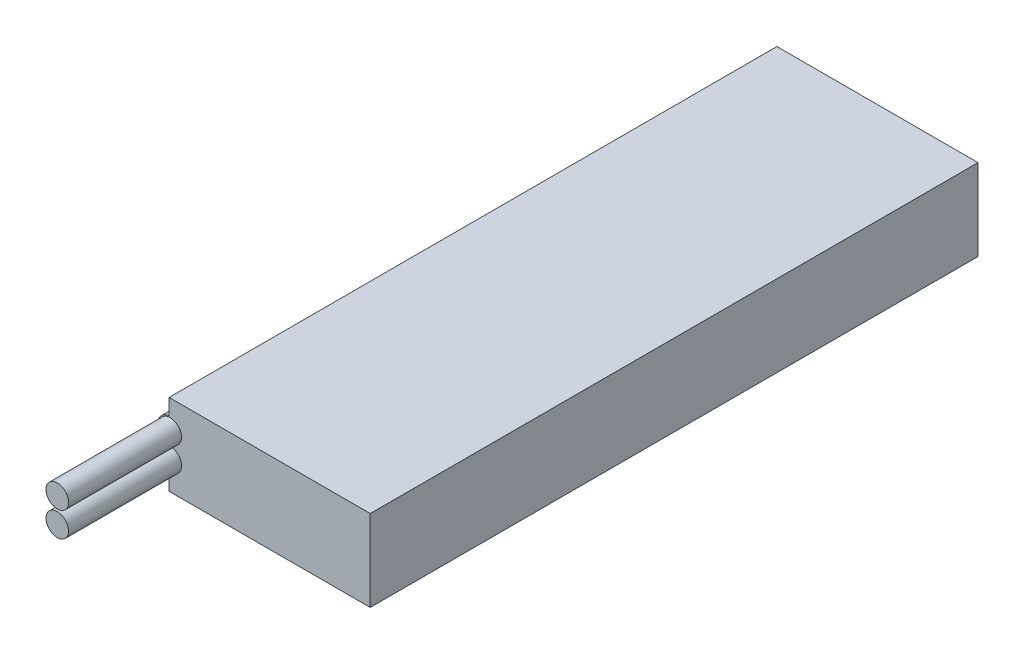
ISO-10303-21;
HEADER;
FILE_DESCRIPTION(('STEP AP214'),'2;1');
FILE_NAME('part.step','',(''),(''),'','','');
FILE_SCHEMA(('AUTOMOTIVE_DESIGN { 1 0 10303 214 1 1 1 1 }'));
ENDSEC;
DATA;
#1=APPLICATION_CONTEXT('core data for automotive mechanical design processes');
#2=APPLICATION_PROTOCOL_DEFINITION('international standard','automotive_design',2000,#1);
#3=PRODUCT_CONTEXT('',#1,'mechanical');
#4=PRODUCT('Part','Part','',(#3));
#5=PRODUCT_RELATED_PRODUCT_CATEGORY('part','',(#4));
#6=PRODUCT_DEFINITION_FORMATION('','',#4);
#7=PRODUCT_DEFINITION_CONTEXT('part definition',#1,'design');
#8=PRODUCT_DEFINITION('design','',#6,#7);
#9=PRODUCT_DEFINITION_SHAPE('','',#8);
#10=(LENGTH_UNIT() NAMED_UNIT(*) SI_UNIT(.MILLI.,.METRE.));
#11=(NAMED_UNIT(*) PLANE_ANGLE_UNIT() SI_UNIT($,.RADIAN.));
#12=(NAMED_UNIT(*) SI_UNIT($,.STERADIAN.) SOLID_ANGLE_UNIT());
#13=UNCERTAINTY_MEASURE_WITH_UNIT(LENGTH_MEASURE(1.E-05),#10,'distance_accuracy_value','');
#14=(GEOMETRIC_REPRESENTATION_CONTEXT(3) GLOBAL_UNCERTAINTY_ASSIGNED_CONTEXT((#13)) GLOBAL_UNIT_ASSIGNED_CONTEXT((#10,
#11,#12)) REPRESENTATION_CONTEXT('',''));
#15=CARTESIAN_POINT('',(0.,0.,0.));
#16=DIRECTION('',(0.,0.,1.));
#17=DIRECTION('',(1.,0.,0.));
#18=AXIS2_PLACEMENT_3D('',#15,#16,#17);
#19=CARTESIAN_POINT('',(22.25,18.,67.25));
#20=DIRECTION('',(-1.,0.,0.));
#21=DIRECTION('',(0.,0.,1.));
#22=AXIS2_PLACEMENT_3D('',#19,#20,#21);
#23=PLANE('',#22);
#24=DIRECTION('',(0.,0.,-1.));
#25=VECTOR('',#24,1.);
#26=CARTESIAN_POINT('',(22.25,0.,67.25));
#27=LINE('',#26,#25);
#28=CARTESIAN_POINT('',(22.25,0.,67.25));
#29=VERTEX_POINT('',#28);
#30=CARTESIAN_POINT('',(22.25,0.,-67.25));
#31=VERTEX_POINT('',#30);
#32=EDGE_CURVE('E150',#29,#31,#27,.T.);
#33=ORIENTED_EDGE('',*,*,#32,.T.);
#34=DIRECTION('',(0.,-1.,0.));
#35=VECTOR('',#34,1.);
#36=CARTESIAN_POINT('',(22.25,18.,-67.25));
#37=LINE('',#36,#35);
#38=CARTESIAN_POINT('',(22.25,18.,-67.25));
#39=VERTEX_POINT('',#38);
#40=EDGE_CURVE('E173',#39,#31,#37,.T.);
#41=ORIENTED_EDGE('',*,*,#40,.F.);
#42=DIRECTION('',(0.,0.,-1.));
#43=VECTOR('',#42,1.);
#44=CARTESIAN_POINT('',(22.25,18.,67.25));
#45=LINE('',#44,#43);
#46=CARTESIAN_POINT('',(22.25,18.,67.25));
#47=VERTEX_POINT('',#46);
#48=EDGE_CURVE('E151',#47,#39,#45,.T.);
#49=ORIENTED_EDGE('',*,*,#48,.F.);
#50=DIRECTION('',(0.,-1.,0.));
#51=VECTOR('',#50,1.);
#52=CARTESIAN_POINT('',(22.25,18.,67.25));
#53=LINE('',#52,#51);
#54=EDGE_CURVE('E160',#47,#29,#53,.T.);
#55=ORIENTED_EDGE('',*,*,#54,.T.);
#56=EDGE_LOOP('',(#33,#41,#49,#55));
#57=FACE_BOUND('',#56,.T.);
#58=ADVANCED_FACE('F43',(#57),#23,.F.);
#59=CARTESIAN_POINT('',(-22.25,18.,-67.25));
#60=DIRECTION('',(0.,0.,1.));
#61=DIRECTION('',(1.,0.,0.));
#62=AXIS2_PLACEMENT_3D('',#59,#60,#61);
#63=PLANE('',#62);
#64=DIRECTION('',(-1.,0.,0.));
#65=VECTOR('',#64,1.);
#66=CARTESIAN_POINT('',(-22.25,0.,-67.25));
#67=LINE('',#66,#65);
#68=CARTESIAN_POINT('',(-22.25,0.,-67.25));
#69=VERTEX_POINT('',#68);
#70=EDGE_CURVE('E162',#31,#69,#67,.T.);
#71=ORIENTED_EDGE('',*,*,#70,.T.);
#72=DIRECTION('',(0.,-1.,0.));
#73=VECTOR('',#72,1.);
#74=CARTESIAN_POINT('',(-22.25,18.,-67.25));
#75=LINE('',#74,#73);
#76=CARTESIAN_POINT('',(-22.25,18.,-67.25));
#77=VERTEX_POINT('',#76);
#78=EDGE_CURVE('E170',#77,#69,#75,.T.);
#79=ORIENTED_EDGE('',*,*,#78,.F.);
#80=DIRECTION('',(-1.,0.,0.));
#81=VECTOR('',#80,1.);
#82=CARTESIAN_POINT('',(-22.25,18.,-67.25));
#83=LINE('',#82,#81);
#84=EDGE_CURVE('E153',#39,#77,#83,.T.);
#85=ORIENTED_EDGE('',*,*,#84,.F.);
#86=ORIENTED_EDGE('',*,*,#40,.T.);
#87=EDGE_LOOP('',(#71,#79,#85,#86));
#88=FACE_BOUND('',#87,.T.);
#89=ADVANCED_FACE('F192',(#88),#63,.F.);
#90=CARTESIAN_POINT('',(-22.25,18.,67.25));
#91=DIRECTION('',(1.,0.,0.));
#92=DIRECTION('',(0.,0.,-1.));
#93=AXIS2_PLACEMENT_3D('',#90,#91,#92);
#94=PLANE('',#93);
#95=DIRECTION('',(0.,-1.,0.));
#96=VECTOR('',#95,1.);
#97=CARTESIAN_POINT('',(-22.25,18.,67.25));
#98=LINE('',#97,#96);
#99=CARTESIAN_POINT('',(-22.25,18.,67.25));
#100=VERTEX_POINT('',#99);
#101=CARTESIAN_POINT('',(-22.25,14.4886127875258,67.25));
#102=VERTEX_POINT('',#101);
#103=EDGE_CURVE('E132',#100,#102,#98,.T.);
#104=ORIENTED_EDGE('',*,*,#103,.F.);
#105=DIRECTION('',(0.,0.,1.));
#106=VECTOR('',#105,1.);
#107=CARTESIAN_POINT('',(-22.25,18.,67.25));
#108=LINE('',#107,#106);
#109=EDGE_CURVE('E156',#77,#100,#108,.T.);
#110=ORIENTED_EDGE('',*,*,#109,.F.);
#111=ORIENTED_EDGE('',*,*,#78,.T.);
#112=DIRECTION('',(0.,0.,1.));
#113=VECTOR('',#112,1.);
#114=CARTESIAN_POINT('',(-22.25,0.,67.25));
#115=LINE('',#114,#113);
#116=CARTESIAN_POINT('',(-22.25,0.,67.25));
#117=VERTEX_POINT('',#116);
#118=EDGE_CURVE('E164',#69,#117,#115,.T.);
#119=ORIENTED_EDGE('',*,*,#118,.T.);
#120=CARTESIAN_POINT('',(-22.25,3.51138721247417,67.25));
#121=VERTEX_POINT('',#120);
#122=EDGE_CURVE('E63',#121,#117,#98,.T.);
#123=ORIENTED_EDGE('',*,*,#122,.F.);
#124=DIRECTION('',(0.,0.,1.));
#125=VECTOR('',#124,1.);
#126=CARTESIAN_POINT('',(-22.25,3.51138721247417,-117.578918128646));
#127=LINE('',#126,#125);
#128=CARTESIAN_POINT('',(-22.25,3.51138721247417,60.25));
#129=VERTEX_POINT('',#128);
#130=EDGE_CURVE('E143',#129,#121,#127,.T.);
#131=ORIENTED_EDGE('',*,*,#130,.F.);
#132=DIRECTION('',(0.,-1.,0.));
#133=VECTOR('',#132,1.);
#134=CARTESIAN_POINT('',(-22.25,18.,60.25));
#135=LINE('',#134,#133);
#136=CARTESIAN_POINT('',(-22.25,14.4886127875258,60.25));
#137=VERTEX_POINT('',#136);
#138=EDGE_CURVE('E57',#137,#129,#135,.T.);
#139=ORIENTED_EDGE('',*,*,#138,.F.);
#140=DIRECTION('',(0.,0.,1.));
#141=VECTOR('',#140,1.);
#142=CARTESIAN_POINT('',(-22.25,14.4886127875258,-117.578918128646));
#143=LINE('',#142,#141);
#144=EDGE_CURVE('E117',#137,#102,#143,.T.);
#145=ORIENTED_EDGE('',*,*,#144,.T.);
#146=EDGE_LOOP('',(#104,#110,#111,#119,#123,#131,#139,#145));
#147=FACE_BOUND('',#146,.T.);
#148=ADVANCED_FACE('F182',(#147),#94,.F.);
#149=CARTESIAN_POINT('',(-22.25,18.,67.25));
#150=DIRECTION('',(0.,0.,-1.));
#151=DIRECTION('',(-1.,0.,0.));
#152=AXIS2_PLACEMENT_3D('',#149,#150,#151);
#153=PLANE('',#152);
#154=CARTESIAN_POINT('',(-22.,6.25,67.25));
#155=DIRECTION('',(0.,0.,-1.));
#156=DIRECTION('',(-1.,0.,0.));
#157=AXIS2_PLACEMENT_3D('',#154,#155,#156);
#158=CIRCLE('',#157,2.5);
#159=CARTESIAN_POINT('',(-24.5,6.25,67.25));
#160=VERTEX_POINT('',#159);
#161=EDGE_CURVE('E12',#160,#160,#158,.F.);
#162=ORIENTED_EDGE('',*,*,#161,.F.);
#163=EDGE_LOOP('',(#162));
#164=FACE_BOUND('',#163,.T.);
#165=CARTESIAN_POINT('',(-22.,11.75,67.25));
#166=DIRECTION('',(0.,0.,-1.));
#167=DIRECTION('',(-1.,0.,0.));
#168=AXIS2_PLACEMENT_3D('',#165,#166,#167);
#169=CIRCLE('',#168,2.5);
#170=CARTESIAN_POINT('',(-24.5,11.75,67.25));
#171=VERTEX_POINT('',#170);
#172=EDGE_CURVE('E50',#171,#171,#169,.F.);
#173=ORIENTED_EDGE('',*,*,#172,.F.);
#174=EDGE_LOOP('',(#173));
#175=FACE_BOUND('',#174,.T.);
#176=DIRECTION('',(1.,0.,0.));
#177=VECTOR('',#176,1.);
#178=CARTESIAN_POINT('',(-22.25,0.,67.25));
#179=LINE('',#178,#177);
#180=EDGE_CURVE('E154',#117,#29,#179,.T.);
#181=ORIENTED_EDGE('',*,*,#180,.T.);
#182=ORIENTED_EDGE('',*,*,#54,.F.);
#183=DIRECTION('',(1.,0.,0.));
#184=VECTOR('',#183,1.);
#185=CARTESIAN_POINT('',(-22.25,18.,67.25));
#186=LINE('',#185,#184);
#187=EDGE_CURVE('E158',#100,#47,#186,.T.);
#188=ORIENTED_EDGE('',*,*,#187,.F.);
#189=ORIENTED_EDGE('',*,*,#103,.T.);
#190=CARTESIAN_POINT('',(-22.,11.75,67.25));
#191=DIRECTION('',(0.,0.,1.));
#192=DIRECTION('',(1.,0.,0.));
#193=AXIS2_PLACEMENT_3D('',#190,#191,#192);
#194=CIRCLE('',#193,2.75);
#195=CARTESIAN_POINT('',(-24.75,11.75,67.25));
#196=VERTEX_POINT('',#195);
#197=EDGE_CURVE('E112',#102,#196,#194,.T.);
#198=ORIENTED_EDGE('',*,*,#197,.T.);
#199=DIRECTION('',(0.,-1.,0.));
#200=VECTOR('',#199,1.);
#201=CARTESIAN_POINT('',(-24.75,0.,67.25));
#202=LINE('',#201,#200);
#203=CARTESIAN_POINT('',(-24.75,6.25,67.25));
#204=VERTEX_POINT('',#203);
#205=EDGE_CURVE('E120',#196,#204,#202,.T.);
#206=ORIENTED_EDGE('',*,*,#205,.T.);
#207=CARTESIAN_POINT('',(-22.,6.25,67.25));
#208=DIRECTION('',(0.,0.,1.));
#209=DIRECTION('',(1.,0.,0.));
#210=AXIS2_PLACEMENT_3D('',#207,#208,#209);
#211=CIRCLE('',#210,2.75);
#212=EDGE_CURVE('E126',#121,#204,#211,.F.);
#213=ORIENTED_EDGE('',*,*,#212,.F.);
#214=ORIENTED_EDGE('',*,*,#122,.T.);
#215=EDGE_LOOP('',(#181,#182,#188,#189,#198,#206,#213,#214));
#216=FACE_BOUND('',#215,.T.);
#217=ADVANCED_FACE('F129',(#164,#175,#216),#153,.F.);
#218=CARTESIAN_POINT('',(0.,18.,0.));
#219=DIRECTION('',(0.,-1.,0.));
#220=DIRECTION('',(0.,0.,-1.));
#221=AXIS2_PLACEMENT_3D('',#218,#219,#220);
#222=PLANE('',#221);
#223=ORIENTED_EDGE('',*,*,#48,.T.);
#224=ORIENTED_EDGE('',*,*,#84,.T.);
#225=ORIENTED_EDGE('',*,*,#109,.T.);
#226=ORIENTED_EDGE('',*,*,#187,.T.);
#227=EDGE_LOOP('',(#223,#224,#225,#226));
#228=FACE_BOUND('',#227,.T.);
#229=ADVANCED_FACE('F181',(#228),#222,.F.);
#230=CARTESIAN_POINT('',(0.,0.,0.));
#231=DIRECTION('',(0.,-1.,0.));
#232=DIRECTION('',(0.,0.,-1.));
#233=AXIS2_PLACEMENT_3D('',#230,#231,#232);
#234=PLANE('',#233);
#235=ORIENTED_EDGE('',*,*,#180,.F.);
#236=ORIENTED_EDGE('',*,*,#118,.F.);
#237=ORIENTED_EDGE('',*,*,#70,.F.);
#238=ORIENTED_EDGE('',*,*,#32,.F.);
#239=EDGE_LOOP('',(#235,#236,#237,#238));
#240=FACE_BOUND('',#239,.T.);
#241=ADVANCED_FACE('F189',(#240),#234,.T.);
#242=CARTESIAN_POINT('',(-22.25,18.,60.25));
#243=DIRECTION('',(0.,0.,1.));
#244=DIRECTION('',(1.,0.,0.));
#245=AXIS2_PLACEMENT_3D('',#242,#243,#244);
#246=PLANE('',#245);
#247=CARTESIAN_POINT('',(-22.,11.75,60.25));
#248=DIRECTION('',(0.,0.,1.));
#249=DIRECTION('',(1.,0.,0.));
#250=AXIS2_PLACEMENT_3D('',#247,#248,#249);
#251=CIRCLE('',#250,2.75);
#252=CARTESIAN_POINT('',(-24.75,11.75,60.25));
#253=VERTEX_POINT('',#252);
#254=EDGE_CURVE('E113',#253,#137,#251,.F.);
#255=ORIENTED_EDGE('',*,*,#254,.T.);
#256=ORIENTED_EDGE('',*,*,#138,.T.);
#257=CARTESIAN_POINT('',(-22.,6.25,60.25));
#258=DIRECTION('',(0.,0.,1.));
#259=DIRECTION('',(1.,0.,0.));
#260=AXIS2_PLACEMENT_3D('',#257,#258,#259);
#261=CIRCLE('',#260,2.75);
#262=CARTESIAN_POINT('',(-24.75,6.25,60.25));
#263=VERTEX_POINT('',#262);
#264=EDGE_CURVE('E139',#263,#129,#261,.T.);
#265=ORIENTED_EDGE('',*,*,#264,.F.);
#266=DIRECTION('',(0.,1.,0.));
#267=VECTOR('',#266,1.);
#268=CARTESIAN_POINT('',(-24.75,0.,60.25));
#269=LINE('',#268,#267);
#270=EDGE_CURVE('E145',#263,#253,#269,.T.);
#271=ORIENTED_EDGE('',*,*,#270,.T.);
#272=EDGE_LOOP('',(#255,#256,#265,#271));
#273=FACE_BOUND('',#272,.T.);
#274=ADVANCED_FACE('F217',(#273),#246,.F.);
#275=CARTESIAN_POINT('',(-22.,6.25,-117.578918128646));
#276=DIRECTION('',(0.,0.,1.));
#277=DIRECTION('',(1.,0.,0.));
#278=AXIS2_PLACEMENT_3D('',#275,#276,#277);
#279=CYLINDRICAL_SURFACE('',#278,2.75);
#280=DIRECTION('',(0.,0.,1.));
#281=VECTOR('',#280,1.);
#282=CARTESIAN_POINT('',(-24.75,6.25,-117.578918128646));
#283=LINE('',#282,#281);
#284=EDGE_CURVE('E116',#263,#204,#283,.T.);
#285=ORIENTED_EDGE('',*,*,#284,.F.);
#286=ORIENTED_EDGE('',*,*,#264,.T.);
#287=ORIENTED_EDGE('',*,*,#130,.T.);
#288=ORIENTED_EDGE('',*,*,#212,.T.);
#289=EDGE_LOOP('',(#285,#286,#287,#288));
#290=FACE_BOUND('',#289,.T.);
#291=ADVANCED_FACE('F214',(#290),#279,.T.);
#292=CARTESIAN_POINT('',(-24.75,0.,-117.578918128646));
#293=DIRECTION('',(-1.,0.,0.));
#294=DIRECTION('',(0.,0.,1.));
#295=AXIS2_PLACEMENT_3D('',#292,#293,#294);
#296=PLANE('',#295);
#297=ORIENTED_EDGE('',*,*,#270,.F.);
#298=ORIENTED_EDGE('',*,*,#284,.T.);
#299=ORIENTED_EDGE('',*,*,#205,.F.);
#300=DIRECTION('',(0.,0.,1.));
#301=VECTOR('',#300,1.);
#302=CARTESIAN_POINT('',(-24.75,11.75,-117.578918128646));
#303=LINE('',#302,#301);
#304=EDGE_CURVE('E107',#253,#196,#303,.T.);
#305=ORIENTED_EDGE('',*,*,#304,.F.);
#306=EDGE_LOOP('',(#297,#298,#299,#305));
#307=FACE_BOUND('',#306,.T.);
#308=ADVANCED_FACE('F121',(#307),#296,.T.);
#309=CARTESIAN_POINT('',(-22.,11.75,-117.578918128646));
#310=DIRECTION('',(0.,0.,1.));
#311=DIRECTION('',(1.,0.,0.));
#312=AXIS2_PLACEMENT_3D('',#309,#310,#311);
#313=CYLINDRICAL_SURFACE('',#312,2.75);
#314=ORIENTED_EDGE('',*,*,#254,.F.);
#315=ORIENTED_EDGE('',*,*,#304,.T.);
#316=ORIENTED_EDGE('',*,*,#197,.F.);
#317=ORIENTED_EDGE('',*,*,#144,.F.);
#318=EDGE_LOOP('',(#314,#315,#316,#317));
#319=FACE_BOUND('',#318,.T.);
#320=ADVANCED_FACE('F109',(#319),#313,.T.);
#321=CARTESIAN_POINT('',(-22.,11.75,92.25));
#322=DIRECTION('',(0.,0.,-1.));
#323=DIRECTION('',(-1.,0.,0.));
#324=AXIS2_PLACEMENT_3D('',#321,#322,#323);
#325=CYLINDRICAL_SURFACE('',#324,2.5);
#326=CARTESIAN_POINT('',(-22.,11.75,92.25));
#327=DIRECTION('',(0.,0.,1.));
#328=DIRECTION('',(1.,0.,0.));
#329=AXIS2_PLACEMENT_3D('',#326,#327,#328);
#330=CIRCLE('',#329,2.5);
#331=CARTESIAN_POINT('',(-19.5,11.75,92.25));
#332=VERTEX_POINT('',#331);
#333=EDGE_CURVE('E133',#332,#332,#330,.T.);
#334=ORIENTED_EDGE('',*,*,#333,.F.);
#335=EDGE_LOOP('',(#334));
#336=FACE_BOUND('',#335,.T.);
#337=ORIENTED_EDGE('',*,*,#172,.T.);
#338=EDGE_LOOP('',(#337));
#339=FACE_BOUND('',#338,.T.);
#340=ADVANCED_FACE('F178',(#336,#339),#325,.T.);
#341=CARTESIAN_POINT('',(-22.,11.75,92.25));
#342=DIRECTION('',(0.,0.,1.));
#343=DIRECTION('',(1.,0.,0.));
#344=AXIS2_PLACEMENT_3D('',#341,#342,#343);
#345=PLANE('',#344);
#346=ORIENTED_EDGE('',*,*,#333,.T.);
#347=EDGE_LOOP('',(#346));
#348=FACE_BOUND('',#347,.T.);
#349=ADVANCED_FACE('F227',(#348),#345,.T.);
#350=CARTESIAN_POINT('',(-22.,6.25,92.25));
#351=DIRECTION('',(0.,0.,-1.));
#352=DIRECTION('',(-1.,0.,0.));
#353=AXIS2_PLACEMENT_3D('',#350,#351,#352);
#354=CYLINDRICAL_SURFACE('',#353,2.5);
#355=CARTESIAN_POINT('',(-22.,6.25,92.25));
#356=DIRECTION('',(0.,0.,1.));
#357=DIRECTION('',(1.,0.,0.));
#358=AXIS2_PLACEMENT_3D('',#355,#356,#357);
#359=CIRCLE('',#358,2.5);
#360=CARTESIAN_POINT('',(-19.5,6.25,92.25));
#361=VERTEX_POINT('',#360);
#362=EDGE_CURVE('E136',#361,#361,#359,.T.);
#363=ORIENTED_EDGE('',*,*,#362,.F.);
#364=EDGE_LOOP('',(#363));
#365=FACE_BOUND('',#364,.T.);
#366=ORIENTED_EDGE('',*,*,#161,.T.);
#367=EDGE_LOOP('',(#366));
#368=FACE_BOUND('',#367,.T.);
#369=ADVANCED_FACE('F224',(#365,#368),#354,.T.);
#370=CARTESIAN_POINT('',(-22.,6.25,92.25));
#371=DIRECTION('',(0.,0.,1.));
#372=DIRECTION('',(1.,0.,0.));
#373=AXIS2_PLACEMENT_3D('',#370,#371,#372);
#374=PLANE('',#373);
#375=ORIENTED_EDGE('',*,*,#362,.T.);
#376=EDGE_LOOP('',(#375));
#377=FACE_BOUND('',#376,.T.);
#378=ADVANCED_FACE('F222',(#377),#374,.T.);
#379=CLOSED_SHELL('',(#58,#89,#148,#217,#229,#241,#274,#291,#308,#320,#340,#349,#369,#378));
#380=MANIFOLD_SOLID_BREP('B2',#379);
#381=ADVANCED_BREP_SHAPE_REPRESENTATION('',(#18,#380),#14);
#382=SHAPE_DEFINITION_REPRESENTATION(#9,#381);
ENDSEC;
END-ISO-10303-21;
